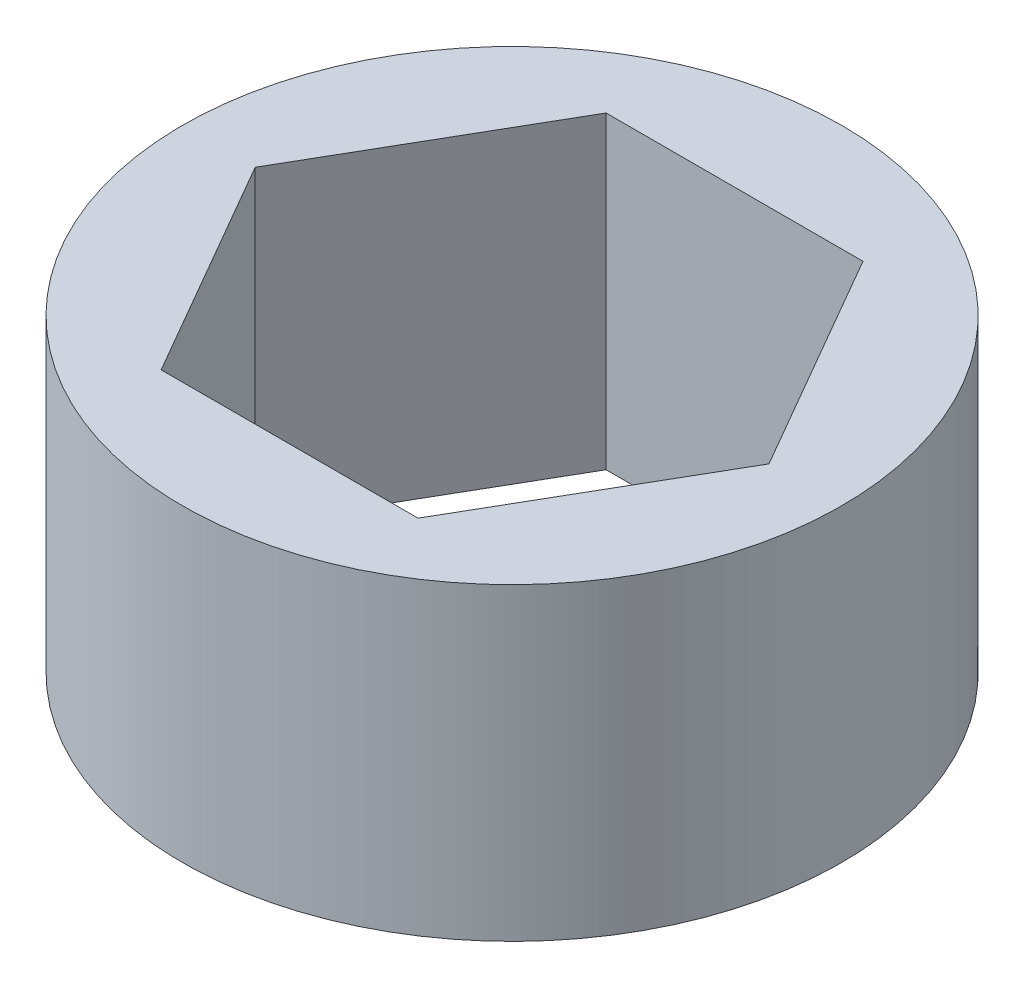
ISO-10303-21;
HEADER;
FILE_DESCRIPTION(('STEP AP214'),'2;1');
FILE_NAME('part.step','',(''),(''),'','','');
FILE_SCHEMA(('AUTOMOTIVE_DESIGN { 1 0 10303 214 1 1 1 1 }'));
ENDSEC;
DATA;
#1=APPLICATION_CONTEXT('core data for automotive mechanical design processes');
#2=APPLICATION_PROTOCOL_DEFINITION('international standard','automotive_design',2000,#1);
#3=PRODUCT_CONTEXT('',#1,'mechanical');
#4=PRODUCT('Part','Part','',(#3));
#5=PRODUCT_RELATED_PRODUCT_CATEGORY('part','',(#4));
#6=PRODUCT_DEFINITION_FORMATION('','',#4);
#7=PRODUCT_DEFINITION_CONTEXT('part definition',#1,'design');
#8=PRODUCT_DEFINITION('design','',#6,#7);
#9=PRODUCT_DEFINITION_SHAPE('','',#8);
#10=(LENGTH_UNIT() NAMED_UNIT(*) SI_UNIT(.MILLI.,.METRE.));
#11=(NAMED_UNIT(*) PLANE_ANGLE_UNIT() SI_UNIT($,.RADIAN.));
#12=(NAMED_UNIT(*) SI_UNIT($,.STERADIAN.) SOLID_ANGLE_UNIT());
#13=UNCERTAINTY_MEASURE_WITH_UNIT(LENGTH_MEASURE(1.E-05),#10,'distance_accuracy_value','');
#14=(GEOMETRIC_REPRESENTATION_CONTEXT(3) GLOBAL_UNCERTAINTY_ASSIGNED_CONTEXT((#13)) GLOBAL_UNIT_ASSIGNED_CONTEXT((#10,
#11,#12)) REPRESENTATION_CONTEXT('',''));
#15=CARTESIAN_POINT('',(0.,0.,0.));
#16=DIRECTION('',(0.,0.,1.));
#17=DIRECTION('',(1.,0.,0.));
#18=AXIS2_PLACEMENT_3D('',#15,#16,#17);
#19=CARTESIAN_POINT('',(0.,9.525,0.));
#20=DIRECTION('',(0.,1.,0.));
#21=DIRECTION('',(0.,0.,1.));
#22=AXIS2_PLACEMENT_3D('',#19,#20,#21);
#23=PLANE('',#22);
#24=CARTESIAN_POINT('',(0.,9.525,0.));
#25=DIRECTION('',(0.,1.,0.));
#26=DIRECTION('',(0.,0.,1.));
#27=AXIS2_PLACEMENT_3D('',#24,#25,#26);
#28=CIRCLE('',#27,10.16);
#29=CARTESIAN_POINT('',(0.,9.525,-10.16));
#30=VERTEX_POINT('',#29);
#31=EDGE_CURVE('E11',#30,#30,#28,.T.);
#32=ORIENTED_EDGE('',*,*,#31,.T.);
#33=EDGE_LOOP('',(#32));
#34=FACE_BOUND('',#33,.T.);
#35=DIRECTION('',(-0.5,0.,-0.866025403784438));
#36=VECTOR('',#35,1.);
#37=CARTESIAN_POINT('',(7.9189362922049,9.525,0.));
#38=LINE('',#37,#36);
#39=CARTESIAN_POINT('',(7.9189362922049,9.525,0.));
#40=VERTEX_POINT('',#39);
#41=CARTESIAN_POINT('',(3.95946814610245,9.525,-6.858));
#42=VERTEX_POINT('',#41);
#43=EDGE_CURVE('E108',#40,#42,#38,.T.);
#44=ORIENTED_EDGE('',*,*,#43,.F.);
#45=DIRECTION('',(0.5,0.,-0.866025403784439));
#46=VECTOR('',#45,1.);
#47=CARTESIAN_POINT('',(3.95946814610245,9.525,6.858));
#48=LINE('',#47,#46);
#49=CARTESIAN_POINT('',(3.95946814610245,9.525,6.858));
#50=VERTEX_POINT('',#49);
#51=EDGE_CURVE('E99',#50,#40,#48,.T.);
#52=ORIENTED_EDGE('',*,*,#51,.F.);
#53=DIRECTION('',(1.,0.,0.));
#54=VECTOR('',#53,1.);
#55=CARTESIAN_POINT('',(-3.95946814610245,9.525,6.858));
#56=LINE('',#55,#54);
#57=CARTESIAN_POINT('',(-3.95946814610245,9.525,6.858));
#58=VERTEX_POINT('',#57);
#59=EDGE_CURVE('E133',#58,#50,#56,.T.);
#60=ORIENTED_EDGE('',*,*,#59,.F.);
#61=DIRECTION('',(0.5,0.,0.866025403784439));
#62=VECTOR('',#61,1.);
#63=CARTESIAN_POINT('',(-7.91893629220491,9.525,0.));
#64=LINE('',#63,#62);
#65=CARTESIAN_POINT('',(-7.91893629220491,9.525,0.));
#66=VERTEX_POINT('',#65);
#67=EDGE_CURVE('E130',#66,#58,#64,.T.);
#68=ORIENTED_EDGE('',*,*,#67,.F.);
#69=DIRECTION('',(-0.5,0.,0.866025403784439));
#70=VECTOR('',#69,1.);
#71=CARTESIAN_POINT('',(-3.95946814610245,9.525,-6.858));
#72=LINE('',#71,#70);
#73=CARTESIAN_POINT('',(-3.95946814610245,9.525,-6.858));
#74=VERTEX_POINT('',#73);
#75=EDGE_CURVE('E125',#74,#66,#72,.T.);
#76=ORIENTED_EDGE('',*,*,#75,.F.);
#77=DIRECTION('',(-1.,0.,0.));
#78=VECTOR('',#77,1.);
#79=CARTESIAN_POINT('',(3.95946814610245,9.525,-6.858));
#80=LINE('',#79,#78);
#81=EDGE_CURVE('E120',#42,#74,#80,.T.);
#82=ORIENTED_EDGE('',*,*,#81,.F.);
#83=EDGE_LOOP('',(#44,#52,#60,#68,#76,#82));
#84=FACE_BOUND('',#83,.T.);
#85=ADVANCED_FACE('F37',(#34,#84),#23,.T.);
#86=CARTESIAN_POINT('',(0.,0.,0.));
#87=DIRECTION('',(0.,1.,0.));
#88=DIRECTION('',(0.,0.,1.));
#89=AXIS2_PLACEMENT_3D('',#86,#87,#88);
#90=PLANE('',#89);
#91=CARTESIAN_POINT('',(0.,0.,0.));
#92=DIRECTION('',(0.,1.,0.));
#93=DIRECTION('',(0.,0.,1.));
#94=AXIS2_PLACEMENT_3D('',#91,#92,#93);
#95=CIRCLE('',#94,10.16);
#96=CARTESIAN_POINT('',(0.,0.,-10.16));
#97=VERTEX_POINT('',#96);
#98=EDGE_CURVE('E41',#97,#97,#95,.T.);
#99=ORIENTED_EDGE('',*,*,#98,.F.);
#100=EDGE_LOOP('',(#99));
#101=FACE_BOUND('',#100,.T.);
#102=DIRECTION('',(0.5,0.,-0.866025403784439));
#103=VECTOR('',#102,1.);
#104=CARTESIAN_POINT('',(3.95946814610245,0.,6.858));
#105=LINE('',#104,#103);
#106=CARTESIAN_POINT('',(3.95946814610245,0.,6.858));
#107=VERTEX_POINT('',#106);
#108=CARTESIAN_POINT('',(7.9189362922049,0.,0.));
#109=VERTEX_POINT('',#108);
#110=EDGE_CURVE('E64',#107,#109,#105,.T.);
#111=ORIENTED_EDGE('',*,*,#110,.T.);
#112=DIRECTION('',(-0.5,0.,-0.866025403784438));
#113=VECTOR('',#112,1.);
#114=CARTESIAN_POINT('',(7.9189362922049,0.,0.));
#115=LINE('',#114,#113);
#116=CARTESIAN_POINT('',(3.95946814610245,0.,-6.858));
#117=VERTEX_POINT('',#116);
#118=EDGE_CURVE('E115',#109,#117,#115,.T.);
#119=ORIENTED_EDGE('',*,*,#118,.T.);
#120=DIRECTION('',(-1.,0.,0.));
#121=VECTOR('',#120,1.);
#122=CARTESIAN_POINT('',(3.95946814610245,0.,-6.858));
#123=LINE('',#122,#121);
#124=CARTESIAN_POINT('',(-3.95946814610245,0.,-6.858));
#125=VERTEX_POINT('',#124);
#126=EDGE_CURVE('E138',#117,#125,#123,.T.);
#127=ORIENTED_EDGE('',*,*,#126,.T.);
#128=DIRECTION('',(-0.5,0.,0.866025403784439));
#129=VECTOR('',#128,1.);
#130=CARTESIAN_POINT('',(-3.95946814610245,0.,-6.858));
#131=LINE('',#130,#129);
#132=CARTESIAN_POINT('',(-7.91893629220491,0.,0.));
#133=VERTEX_POINT('',#132);
#134=EDGE_CURVE('E142',#125,#133,#131,.T.);
#135=ORIENTED_EDGE('',*,*,#134,.T.);
#136=DIRECTION('',(0.5,0.,0.866025403784439));
#137=VECTOR('',#136,1.);
#138=CARTESIAN_POINT('',(-7.91893629220491,0.,0.));
#139=LINE('',#138,#137);
#140=CARTESIAN_POINT('',(-3.95946814610245,0.,6.858));
#141=VERTEX_POINT('',#140);
#142=EDGE_CURVE('E146',#133,#141,#139,.T.);
#143=ORIENTED_EDGE('',*,*,#142,.T.);
#144=DIRECTION('',(1.,0.,0.));
#145=VECTOR('',#144,1.);
#146=CARTESIAN_POINT('',(-3.95946814610245,0.,6.858));
#147=LINE('',#146,#145);
#148=EDGE_CURVE('E109',#141,#107,#147,.T.);
#149=ORIENTED_EDGE('',*,*,#148,.T.);
#150=EDGE_LOOP('',(#111,#119,#127,#135,#143,#149));
#151=FACE_BOUND('',#150,.T.);
#152=ADVANCED_FACE('F169',(#101,#151),#90,.F.);
#153=CARTESIAN_POINT('',(0.,9.525,0.));
#154=DIRECTION('',(0.,-1.,0.));
#155=DIRECTION('',(0.,0.,-1.));
#156=AXIS2_PLACEMENT_3D('',#153,#154,#155);
#157=CYLINDRICAL_SURFACE('',#156,10.16);
#158=CARTESIAN_POINT('',(0.,9.525,-10.16));
#159=CARTESIAN_POINT('',(0.,9.42578125,-10.16));
#160=CARTESIAN_POINT('',(0.,9.3265625,-10.16));
#161=CARTESIAN_POINT('',(0.,9.128125,-10.16));
#162=CARTESIAN_POINT('',(0.,9.02890625,-10.16));
#163=CARTESIAN_POINT('',(0.,8.83046875,-10.16));
#164=CARTESIAN_POINT('',(0.,8.73125,-10.16));
#165=CARTESIAN_POINT('',(0.,8.5328125,-10.16));
#166=CARTESIAN_POINT('',(0.,8.43359375,-10.16));
#167=CARTESIAN_POINT('',(0.,8.23515625,-10.16));
#168=CARTESIAN_POINT('',(0.,8.1359375,-10.16));
#169=CARTESIAN_POINT('',(0.,7.9375,-10.16));
#170=CARTESIAN_POINT('',(0.,7.83828125,-10.16));
#171=CARTESIAN_POINT('',(0.,7.63984375,-10.16));
#172=CARTESIAN_POINT('',(0.,7.540625,-10.16));
#173=CARTESIAN_POINT('',(0.,7.3421875,-10.16));
#174=CARTESIAN_POINT('',(0.,7.24296875,-10.16));
#175=CARTESIAN_POINT('',(0.,7.04453125,-10.16));
#176=CARTESIAN_POINT('',(0.,6.9453125,-10.16));
#177=CARTESIAN_POINT('',(0.,6.746875,-10.16));
#178=CARTESIAN_POINT('',(0.,6.64765625,-10.16));
#179=CARTESIAN_POINT('',(0.,6.44921875,-10.16));
#180=CARTESIAN_POINT('',(0.,6.35,-10.16));
#181=CARTESIAN_POINT('',(0.,6.1515625,-10.16));
#182=CARTESIAN_POINT('',(0.,6.05234375,-10.16));
#183=CARTESIAN_POINT('',(0.,5.85390625,-10.16));
#184=CARTESIAN_POINT('',(0.,5.7546875,-10.16));
#185=CARTESIAN_POINT('',(0.,5.55625,-10.16));
#186=CARTESIAN_POINT('',(0.,5.45703125,-10.16));
#187=CARTESIAN_POINT('',(0.,5.25859375,-10.16));
#188=CARTESIAN_POINT('',(0.,5.159375,-10.16));
#189=CARTESIAN_POINT('',(0.,4.9609375,-10.16));
#190=CARTESIAN_POINT('',(0.,4.86171875,-10.16));
#191=CARTESIAN_POINT('',(0.,4.66328125,-10.16));
#192=CARTESIAN_POINT('',(0.,4.5640625,-10.16));
#193=CARTESIAN_POINT('',(0.,4.365625,-10.16));
#194=CARTESIAN_POINT('',(0.,4.26640625,-10.16));
#195=CARTESIAN_POINT('',(0.,4.06796875,-10.16));
#196=CARTESIAN_POINT('',(0.,3.96875,-10.16));
#197=CARTESIAN_POINT('',(0.,3.7703125,-10.16));
#198=CARTESIAN_POINT('',(0.,3.67109375,-10.16));
#199=CARTESIAN_POINT('',(0.,3.47265625,-10.16));
#200=CARTESIAN_POINT('',(0.,3.3734375,-10.16));
#201=CARTESIAN_POINT('',(0.,3.175,-10.16));
#202=CARTESIAN_POINT('',(0.,3.07578125,-10.16));
#203=CARTESIAN_POINT('',(0.,2.87734375,-10.16));
#204=CARTESIAN_POINT('',(0.,2.778125,-10.16));
#205=CARTESIAN_POINT('',(0.,2.5796875,-10.16));
#206=CARTESIAN_POINT('',(0.,2.48046875,-10.16));
#207=CARTESIAN_POINT('',(0.,2.28203125,-10.16));
#208=CARTESIAN_POINT('',(0.,2.1828125,-10.16));
#209=CARTESIAN_POINT('',(0.,1.984375,-10.16));
#210=CARTESIAN_POINT('',(0.,1.88515625,-10.16));
#211=CARTESIAN_POINT('',(0.,1.68671875,-10.16));
#212=CARTESIAN_POINT('',(0.,1.5875,-10.16));
#213=CARTESIAN_POINT('',(0.,1.3890625,-10.16));
#214=CARTESIAN_POINT('',(0.,1.28984375,-10.16));
#215=CARTESIAN_POINT('',(0.,1.09140625,-10.16));
#216=CARTESIAN_POINT('',(0.,0.992187500000001,-10.16));
#217=CARTESIAN_POINT('',(0.,0.793750000000001,-10.16));
#218=CARTESIAN_POINT('',(0.,0.69453125,-10.16));
#219=CARTESIAN_POINT('',(0.,0.49609375,-10.16));
#220=CARTESIAN_POINT('',(0.,0.396875,-10.16));
#221=CARTESIAN_POINT('',(0.,0.1984375,-10.16));
#222=CARTESIAN_POINT('',(0.,0.0992187500000001,-10.16));
#223=CARTESIAN_POINT('',(0.,0.,-10.16));
#224=B_SPLINE_CURVE_WITH_KNOTS('',3,(#158,#159,#160,#161,#162,#163,#164,#165,#166,#167,#168,
#169,#170,#171,#172,#173,#174,#175,#176,#177,#178,#179,#180,#181,#182,#183,#184,#185,#186,#187,
#188,#189,#190,#191,#192,#193,#194,#195,#196,#197,#198,#199,#200,#201,#202,#203,#204,#205,#206,
#207,#208,#209,#210,#211,#212,#213,#214,#215,#216,#217,#218,#219,#220,#221,#222,#223),
.UNSPECIFIED.,.F.,.F.,(4,2,2,2,2,2,2,2,2,2,2,2,2,2,2,2,2,2,2,2,2,2,2,2,2,2,2,2,2,2,2,2,4),(0.,
0.29765625,0.5953125,0.892968750000001,1.190625,1.48828125,1.7859375,2.08359375,2.38125,
2.67890625,2.9765625,3.27421875,3.571875,3.86953125,4.1671875,4.46484375,4.7625,5.06015625,
5.3578125,5.65546875,5.953125,6.25078125,6.5484375,6.84609375,7.14375,7.44140625,7.7390625,
8.03671875,8.334375,8.63203125,8.9296875,9.22734375,9.525),.UNSPECIFIED.);
#225=EDGE_CURVE('BSEAM39',#30,#97,#224,.T.);
#226=ORIENTED_EDGE('',*,*,#31,.F.);
#227=ORIENTED_EDGE('',*,*,#98,.T.);
#228=ORIENTED_EDGE('',*,*,#225,.T.);
#229=ORIENTED_EDGE('',*,*,#225,.F.);
#230=EDGE_LOOP('',(#226,#228,#227,#229));
#231=FACE_BOUND('',#230,.T.);
#232=ADVANCED_FACE('F39',(#231),#157,.T.);
#233=CARTESIAN_POINT('',(3.95946814610245,9.525,6.858));
#234=DIRECTION('',(-0.866025403784439,0.,-0.5));
#235=DIRECTION('',(-0.5,0.,0.866025403784439));
#236=AXIS2_PLACEMENT_3D('',#233,#234,#235);
#237=PLANE('',#236);
#238=ORIENTED_EDGE('',*,*,#110,.F.);
#239=DIRECTION('',(0.,-1.,0.));
#240=VECTOR('',#239,1.);
#241=CARTESIAN_POINT('',(3.95946814610245,9.525,6.858));
#242=LINE('',#241,#240);
#243=EDGE_CURVE('E103',#50,#107,#242,.T.);
#244=ORIENTED_EDGE('',*,*,#243,.F.);
#245=ORIENTED_EDGE('',*,*,#51,.T.);
#246=DIRECTION('',(0.,-1.,0.));
#247=VECTOR('',#246,1.);
#248=CARTESIAN_POINT('',(7.9189362922049,9.525,0.));
#249=LINE('',#248,#247);
#250=EDGE_CURVE('E102',#40,#109,#249,.T.);
#251=ORIENTED_EDGE('',*,*,#250,.T.);
#252=EDGE_LOOP('',(#238,#244,#245,#251));
#253=FACE_BOUND('',#252,.T.);
#254=ADVANCED_FACE('F101',(#253),#237,.T.);
#255=CARTESIAN_POINT('',(7.9189362922049,9.525,0.));
#256=DIRECTION('',(-0.866025403784439,0.,0.5));
#257=DIRECTION('',(0.5,0.,0.866025403784439));
#258=AXIS2_PLACEMENT_3D('',#255,#256,#257);
#259=PLANE('',#258);
#260=ORIENTED_EDGE('',*,*,#118,.F.);
#261=ORIENTED_EDGE('',*,*,#250,.F.);
#262=ORIENTED_EDGE('',*,*,#43,.T.);
#263=DIRECTION('',(0.,-1.,0.));
#264=VECTOR('',#263,1.);
#265=CARTESIAN_POINT('',(3.95946814610245,9.525,-6.858));
#266=LINE('',#265,#264);
#267=EDGE_CURVE('E116',#42,#117,#266,.T.);
#268=ORIENTED_EDGE('',*,*,#267,.T.);
#269=EDGE_LOOP('',(#260,#261,#262,#268));
#270=FACE_BOUND('',#269,.T.);
#271=ADVANCED_FACE('F112',(#270),#259,.T.);
#272=CARTESIAN_POINT('',(3.95946814610245,9.525,-6.858));
#273=DIRECTION('',(0.,0.,1.));
#274=DIRECTION('',(1.,0.,0.));
#275=AXIS2_PLACEMENT_3D('',#272,#273,#274);
#276=PLANE('',#275);
#277=ORIENTED_EDGE('',*,*,#126,.F.);
#278=ORIENTED_EDGE('',*,*,#267,.F.);
#279=ORIENTED_EDGE('',*,*,#81,.T.);
#280=DIRECTION('',(0.,-1.,0.));
#281=VECTOR('',#280,1.);
#282=CARTESIAN_POINT('',(-3.95946814610245,9.525,-6.858));
#283=LINE('',#282,#281);
#284=EDGE_CURVE('E160',#74,#125,#283,.T.);
#285=ORIENTED_EDGE('',*,*,#284,.T.);
#286=EDGE_LOOP('',(#277,#278,#279,#285));
#287=FACE_BOUND('',#286,.T.);
#288=ADVANCED_FACE('F165',(#287),#276,.T.);
#289=CARTESIAN_POINT('',(-3.95946814610245,9.525,-6.858));
#290=DIRECTION('',(0.866025403784439,0.,0.5));
#291=DIRECTION('',(0.5,0.,-0.866025403784439));
#292=AXIS2_PLACEMENT_3D('',#289,#290,#291);
#293=PLANE('',#292);
#294=ORIENTED_EDGE('',*,*,#134,.F.);
#295=ORIENTED_EDGE('',*,*,#284,.F.);
#296=ORIENTED_EDGE('',*,*,#75,.T.);
#297=DIRECTION('',(0.,-1.,0.));
#298=VECTOR('',#297,1.);
#299=CARTESIAN_POINT('',(-7.91893629220491,9.525,0.));
#300=LINE('',#299,#298);
#301=EDGE_CURVE('E157',#66,#133,#300,.T.);
#302=ORIENTED_EDGE('',*,*,#301,.T.);
#303=EDGE_LOOP('',(#294,#295,#296,#302));
#304=FACE_BOUND('',#303,.T.);
#305=ADVANCED_FACE('F177',(#304),#293,.T.);
#306=CARTESIAN_POINT('',(-7.91893629220491,9.525,0.));
#307=DIRECTION('',(0.866025403784439,0.,-0.5));
#308=DIRECTION('',(-0.5,0.,-0.866025403784438));
#309=AXIS2_PLACEMENT_3D('',#306,#307,#308);
#310=PLANE('',#309);
#311=ORIENTED_EDGE('',*,*,#142,.F.);
#312=ORIENTED_EDGE('',*,*,#301,.F.);
#313=ORIENTED_EDGE('',*,*,#67,.T.);
#314=DIRECTION('',(0.,-1.,0.));
#315=VECTOR('',#314,1.);
#316=CARTESIAN_POINT('',(-3.95946814610245,9.525,6.858));
#317=LINE('',#316,#315);
#318=EDGE_CURVE('E56',#58,#141,#317,.T.);
#319=ORIENTED_EDGE('',*,*,#318,.T.);
#320=EDGE_LOOP('',(#311,#312,#313,#319));
#321=FACE_BOUND('',#320,.T.);
#322=ADVANCED_FACE('F175',(#321),#310,.T.);
#323=CARTESIAN_POINT('',(-3.95946814610245,9.525,6.858));
#324=DIRECTION('',(0.,0.,-1.));
#325=DIRECTION('',(-1.,0.,0.));
#326=AXIS2_PLACEMENT_3D('',#323,#324,#325);
#327=PLANE('',#326);
#328=ORIENTED_EDGE('',*,*,#148,.F.);
#329=ORIENTED_EDGE('',*,*,#318,.F.);
#330=ORIENTED_EDGE('',*,*,#59,.T.);
#331=ORIENTED_EDGE('',*,*,#243,.T.);
#332=EDGE_LOOP('',(#328,#329,#330,#331));
#333=FACE_BOUND('',#332,.T.);
#334=ADVANCED_FACE('F171',(#333),#327,.T.);
#335=CLOSED_SHELL('',(#85,#152,#232,#254,#271,#288,#305,#322,#334));
#336=MANIFOLD_SOLID_BREP('B2',#335);
#337=ADVANCED_BREP_SHAPE_REPRESENTATION('',(#18,#336),#14);
#338=SHAPE_DEFINITION_REPRESENTATION(#9,#337);
ENDSEC;
END-ISO-10303-21;
